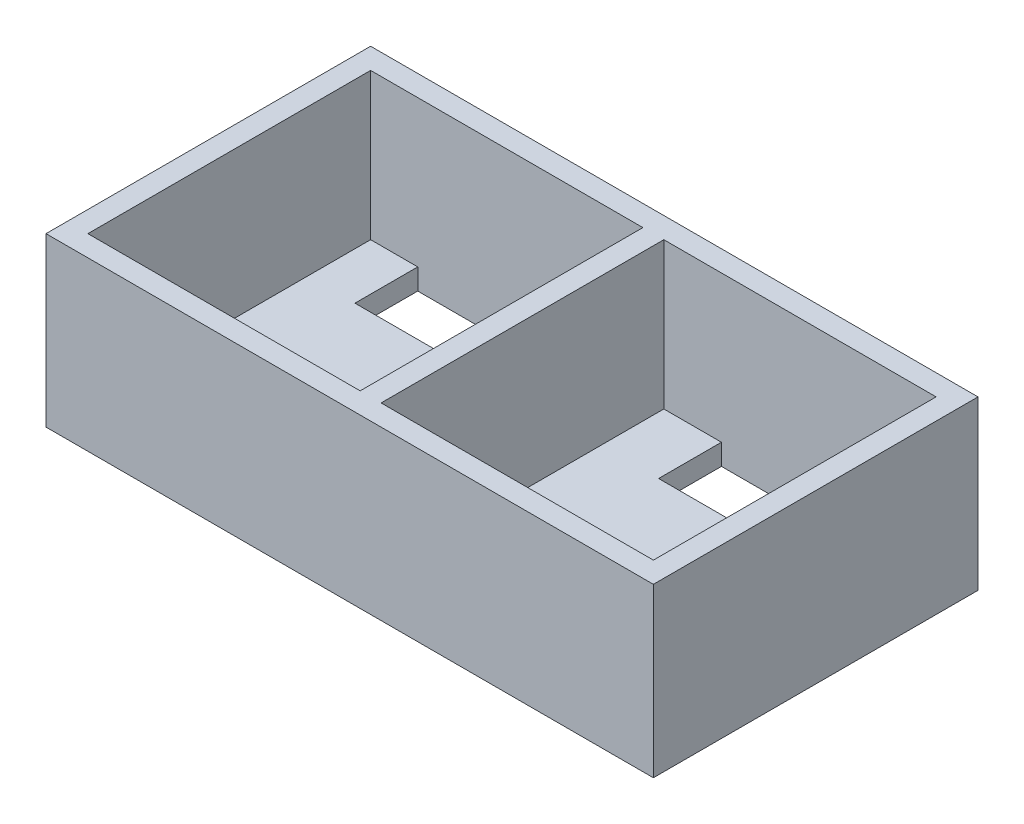
ISO-10303-21;
HEADER;
FILE_DESCRIPTION(('STEP AP214'),'2;1');
FILE_NAME('part.step','',(''),(''),'','','');
FILE_SCHEMA(('AUTOMOTIVE_DESIGN { 1 0 10303 214 1 1 1 1 }'));
ENDSEC;
DATA;
#1=APPLICATION_CONTEXT('core data for automotive mechanical design processes');
#2=APPLICATION_PROTOCOL_DEFINITION('international standard','automotive_design',2000,#1);
#3=PRODUCT_CONTEXT('',#1,'mechanical');
#4=PRODUCT('Part','Part','',(#3));
#5=PRODUCT_RELATED_PRODUCT_CATEGORY('part','',(#4));
#6=PRODUCT_DEFINITION_FORMATION('','',#4);
#7=PRODUCT_DEFINITION_CONTEXT('part definition',#1,'design');
#8=PRODUCT_DEFINITION('design','',#6,#7);
#9=PRODUCT_DEFINITION_SHAPE('','',#8);
#10=(LENGTH_UNIT() NAMED_UNIT(*) SI_UNIT(.MILLI.,.METRE.));
#11=(NAMED_UNIT(*) PLANE_ANGLE_UNIT() SI_UNIT($,.RADIAN.));
#12=(NAMED_UNIT(*) SI_UNIT($,.STERADIAN.) SOLID_ANGLE_UNIT());
#13=UNCERTAINTY_MEASURE_WITH_UNIT(LENGTH_MEASURE(1.E-05),#10,'distance_accuracy_value','');
#14=(GEOMETRIC_REPRESENTATION_CONTEXT(3) GLOBAL_UNCERTAINTY_ASSIGNED_CONTEXT((#13)) GLOBAL_UNIT_ASSIGNED_CONTEXT((#10,
#11,#12)) REPRESENTATION_CONTEXT('',''));
#15=CARTESIAN_POINT('',(0.,0.,0.));
#16=DIRECTION('',(0.,0.,1.));
#17=DIRECTION('',(1.,0.,0.));
#18=AXIS2_PLACEMENT_3D('',#15,#16,#17);
#19=CARTESIAN_POINT('',(0.,1.,0.));
#20=DIRECTION('',(0.,-1.,0.));
#21=DIRECTION('',(0.,0.,-1.));
#22=AXIS2_PLACEMENT_3D('',#19,#20,#21);
#23=PLANE('',#22);
#24=DIRECTION('',(0.,0.,-1.));
#25=VECTOR('',#24,1.);
#26=CARTESIAN_POINT('',(11.25,1.,0.));
#27=LINE('',#26,#25);
#28=CARTESIAN_POINT('',(11.25,1.,6.75000000000001));
#29=VERTEX_POINT('',#28);
#30=CARTESIAN_POINT('',(11.25,1.,3.75000000000001));
#31=VERTEX_POINT('',#30);
#32=EDGE_CURVE('E399',#29,#31,#27,.T.);
#33=ORIENTED_EDGE('',*,*,#32,.F.);
#34=DIRECTION('',(1.,0.,0.));
#35=VECTOR('',#34,1.);
#36=CARTESIAN_POINT('',(0.,1.,6.75));
#37=LINE('',#36,#35);
#38=CARTESIAN_POINT('',(13.5,1.,6.75000000000001));
#39=VERTEX_POINT('',#38);
#40=EDGE_CURVE('E300',#29,#39,#37,.T.);
#41=ORIENTED_EDGE('',*,*,#40,.T.);
#42=DIRECTION('',(0.,0.,-1.));
#43=VECTOR('',#42,1.);
#44=CARTESIAN_POINT('',(13.5,1.,0.));
#45=LINE('',#44,#43);
#46=CARTESIAN_POINT('',(13.5,1.,-6.75000000000001));
#47=VERTEX_POINT('',#46);
#48=EDGE_CURVE('E254',#39,#47,#45,.T.);
#49=ORIENTED_EDGE('',*,*,#48,.T.);
#50=DIRECTION('',(-1.,0.,0.));
#51=VECTOR('',#50,1.);
#52=CARTESIAN_POINT('',(0.,1.,-6.75));
#53=LINE('',#52,#51);
#54=CARTESIAN_POINT('',(11.25,1.,-6.75));
#55=VERTEX_POINT('',#54);
#56=EDGE_CURVE('E231',#47,#55,#53,.T.);
#57=ORIENTED_EDGE('',*,*,#56,.T.);
#58=DIRECTION('',(0.,0.,1.));
#59=VECTOR('',#58,1.);
#60=CARTESIAN_POINT('',(11.25,1.,0.));
#61=LINE('',#60,#59);
#62=CARTESIAN_POINT('',(11.25,1.,-3.75));
#63=VERTEX_POINT('',#62);
#64=EDGE_CURVE('E241',#55,#63,#61,.T.);
#65=ORIENTED_EDGE('',*,*,#64,.T.);
#66=DIRECTION('',(-1.,0.,0.));
#67=VECTOR('',#66,1.);
#68=CARTESIAN_POINT('',(0.,1.,-3.75));
#69=LINE('',#68,#67);
#70=CARTESIAN_POINT('',(3.25,1.,-3.75));
#71=VERTEX_POINT('',#70);
#72=EDGE_CURVE('E238',#63,#71,#69,.T.);
#73=ORIENTED_EDGE('',*,*,#72,.T.);
#74=DIRECTION('',(0.,0.,1.));
#75=VECTOR('',#74,1.);
#76=CARTESIAN_POINT('',(3.25,1.,0.));
#77=LINE('',#76,#75);
#78=CARTESIAN_POINT('',(3.25,1.,-6.75));
#79=VERTEX_POINT('',#78);
#80=EDGE_CURVE('E249',#79,#71,#77,.T.);
#81=ORIENTED_EDGE('',*,*,#80,.F.);
#82=CARTESIAN_POINT('',(0.5,1.,-6.75000000000001));
#83=VERTEX_POINT('',#82);
#84=EDGE_CURVE('E258',#79,#83,#53,.T.);
#85=ORIENTED_EDGE('',*,*,#84,.T.);
#86=DIRECTION('',(0.,0.,-1.));
#87=VECTOR('',#86,1.);
#88=CARTESIAN_POINT('',(0.5,1.,-6.75000000000001));
#89=LINE('',#88,#87);
#90=CARTESIAN_POINT('',(0.5,1.,6.75));
#91=VERTEX_POINT('',#90);
#92=EDGE_CURVE('E356',#91,#83,#89,.T.);
#93=ORIENTED_EDGE('',*,*,#92,.F.);
#94=CARTESIAN_POINT('',(3.25,1.,6.75000000000001));
#95=VERTEX_POINT('',#94);
#96=EDGE_CURVE('E323',#91,#95,#37,.T.);
#97=ORIENTED_EDGE('',*,*,#96,.T.);
#98=DIRECTION('',(0.,0.,-1.));
#99=VECTOR('',#98,1.);
#100=CARTESIAN_POINT('',(3.25,1.,0.));
#101=LINE('',#100,#99);
#102=CARTESIAN_POINT('',(3.25,1.,3.75000000000001));
#103=VERTEX_POINT('',#102);
#104=EDGE_CURVE('E413',#95,#103,#101,.T.);
#105=ORIENTED_EDGE('',*,*,#104,.T.);
#106=DIRECTION('',(-1.,0.,0.));
#107=VECTOR('',#106,1.);
#108=CARTESIAN_POINT('',(0.,1.,3.75));
#109=LINE('',#108,#107);
#110=EDGE_CURVE('E425',#31,#103,#109,.T.);
#111=ORIENTED_EDGE('',*,*,#110,.F.);
#112=EDGE_LOOP('',(#33,#41,#49,#57,#65,#73,#81,#85,#93,#97,#105,#111));
#113=FACE_BOUND('',#112,.T.);
#114=ADVANCED_FACE('F39',(#113),#23,.F.);
#115=CARTESIAN_POINT('',(0.,0.,0.));
#116=DIRECTION('',(0.,-1.,0.));
#117=DIRECTION('',(0.,0.,-1.));
#118=AXIS2_PLACEMENT_3D('',#115,#116,#117);
#119=PLANE('',#118);
#120=DIRECTION('',(0.,0.,1.));
#121=VECTOR('',#120,1.);
#122=CARTESIAN_POINT('',(11.25,0.,0.));
#123=LINE('',#122,#121);
#124=CARTESIAN_POINT('',(11.25,0.,3.75000000000001));
#125=VERTEX_POINT('',#124);
#126=CARTESIAN_POINT('',(11.25,0.,6.75000000000001));
#127=VERTEX_POINT('',#126);
#128=EDGE_CURVE('E473',#125,#127,#123,.T.);
#129=ORIENTED_EDGE('',*,*,#128,.F.);
#130=DIRECTION('',(1.,0.,0.));
#131=VECTOR('',#130,1.);
#132=CARTESIAN_POINT('',(0.,0.,3.75));
#133=LINE('',#132,#131);
#134=CARTESIAN_POINT('',(3.25,0.,3.75000000000001));
#135=VERTEX_POINT('',#134);
#136=EDGE_CURVE('E459',#135,#125,#133,.T.);
#137=ORIENTED_EDGE('',*,*,#136,.F.);
#138=DIRECTION('',(0.,0.,1.));
#139=VECTOR('',#138,1.);
#140=CARTESIAN_POINT('',(3.25,0.,0.));
#141=LINE('',#140,#139);
#142=CARTESIAN_POINT('',(3.25,0.,6.75000000000001));
#143=VERTEX_POINT('',#142);
#144=EDGE_CURVE('E466',#135,#143,#141,.T.);
#145=ORIENTED_EDGE('',*,*,#144,.T.);
#146=DIRECTION('',(-1.,0.,0.));
#147=VECTOR('',#146,1.);
#148=CARTESIAN_POINT('',(0.,0.,6.75));
#149=LINE('',#148,#147);
#150=EDGE_CURVE('E470',#127,#143,#149,.T.);
#151=ORIENTED_EDGE('',*,*,#150,.F.);
#152=EDGE_LOOP('',(#129,#137,#145,#151));
#153=FACE_BOUND('',#152,.T.);
#154=DIRECTION('',(0.,0.,1.));
#155=VECTOR('',#154,1.);
#156=CARTESIAN_POINT('',(-14.5,0.,7.75));
#157=LINE('',#156,#155);
#158=CARTESIAN_POINT('',(-14.5,0.,-7.75));
#159=VERTEX_POINT('',#158);
#160=CARTESIAN_POINT('',(-14.5,0.,7.75));
#161=VERTEX_POINT('',#160);
#162=EDGE_CURVE('E311',#159,#161,#157,.T.);
#163=ORIENTED_EDGE('',*,*,#162,.F.);
#164=DIRECTION('',(-1.,0.,0.));
#165=VECTOR('',#164,1.);
#166=CARTESIAN_POINT('',(-14.5,0.,-7.75));
#167=LINE('',#166,#165);
#168=CARTESIAN_POINT('',(14.5,0.,-7.75000000000001));
#169=VERTEX_POINT('',#168);
#170=EDGE_CURVE('E520',#169,#159,#167,.T.);
#171=ORIENTED_EDGE('',*,*,#170,.F.);
#172=DIRECTION('',(0.,0.,-1.));
#173=VECTOR('',#172,1.);
#174=CARTESIAN_POINT('',(14.5,0.,7.75000000000001));
#175=LINE('',#174,#173);
#176=CARTESIAN_POINT('',(14.5,0.,7.75000000000001));
#177=VERTEX_POINT('',#176);
#178=EDGE_CURVE('E536',#177,#169,#175,.T.);
#179=ORIENTED_EDGE('',*,*,#178,.F.);
#180=DIRECTION('',(1.,0.,0.));
#181=VECTOR('',#180,1.);
#182=CARTESIAN_POINT('',(-14.5,0.,7.75));
#183=LINE('',#182,#181);
#184=EDGE_CURVE('E533',#161,#177,#183,.T.);
#185=ORIENTED_EDGE('',*,*,#184,.F.);
#186=EDGE_LOOP('',(#163,#171,#179,#185));
#187=FACE_BOUND('',#186,.T.);
#188=DIRECTION('',(-1.,0.,0.));
#189=VECTOR('',#188,1.);
#190=CARTESIAN_POINT('',(0.,0.,-3.75));
#191=LINE('',#190,#189);
#192=CARTESIAN_POINT('',(-3.25,0.,-3.75));
#193=VERTEX_POINT('',#192);
#194=CARTESIAN_POINT('',(-11.25,0.,-3.75));
#195=VERTEX_POINT('',#194);
#196=EDGE_CURVE('E563',#193,#195,#191,.T.);
#197=ORIENTED_EDGE('',*,*,#196,.F.);
#198=DIRECTION('',(0.,0.,-1.));
#199=VECTOR('',#198,1.);
#200=CARTESIAN_POINT('',(-3.25,0.,0.));
#201=LINE('',#200,#199);
#202=CARTESIAN_POINT('',(-3.25,0.,-6.75));
#203=VERTEX_POINT('',#202);
#204=EDGE_CURVE('E566',#193,#203,#201,.T.);
#205=ORIENTED_EDGE('',*,*,#204,.T.);
#206=DIRECTION('',(1.,0.,0.));
#207=VECTOR('',#206,1.);
#208=CARTESIAN_POINT('',(0.,0.,-6.75));
#209=LINE('',#208,#207);
#210=CARTESIAN_POINT('',(-11.25,0.,-6.75));
#211=VERTEX_POINT('',#210);
#212=EDGE_CURVE('E556',#211,#203,#209,.T.);
#213=ORIENTED_EDGE('',*,*,#212,.F.);
#214=DIRECTION('',(0.,0.,-1.));
#215=VECTOR('',#214,1.);
#216=CARTESIAN_POINT('',(-11.25,0.,0.));
#217=LINE('',#216,#215);
#218=EDGE_CURVE('E559',#195,#211,#217,.T.);
#219=ORIENTED_EDGE('',*,*,#218,.F.);
#220=EDGE_LOOP('',(#197,#205,#213,#219));
#221=FACE_BOUND('',#220,.T.);
#222=DIRECTION('',(1.,0.,0.));
#223=VECTOR('',#222,1.);
#224=CARTESIAN_POINT('',(0.,0.,-3.75));
#225=LINE('',#224,#223);
#226=CARTESIAN_POINT('',(3.25,0.,-3.75));
#227=VERTEX_POINT('',#226);
#228=CARTESIAN_POINT('',(11.25,0.,-3.75));
#229=VERTEX_POINT('',#228);
#230=EDGE_CURVE('E451',#227,#229,#225,.T.);
#231=ORIENTED_EDGE('',*,*,#230,.T.);
#232=DIRECTION('',(0.,0.,-1.));
#233=VECTOR('',#232,1.);
#234=CARTESIAN_POINT('',(11.25,0.,0.));
#235=LINE('',#234,#233);
#236=CARTESIAN_POINT('',(11.25,0.,-6.75));
#237=VERTEX_POINT('',#236);
#238=EDGE_CURVE('E454',#229,#237,#235,.T.);
#239=ORIENTED_EDGE('',*,*,#238,.T.);
#240=DIRECTION('',(1.,0.,0.));
#241=VECTOR('',#240,1.);
#242=CARTESIAN_POINT('',(0.,0.,-6.75));
#243=LINE('',#242,#241);
#244=CARTESIAN_POINT('',(3.25,0.,-6.75));
#245=VERTEX_POINT('',#244);
#246=EDGE_CURVE('E233',#245,#237,#243,.T.);
#247=ORIENTED_EDGE('',*,*,#246,.F.);
#248=DIRECTION('',(0.,0.,-1.));
#249=VECTOR('',#248,1.);
#250=CARTESIAN_POINT('',(3.25,0.,0.));
#251=LINE('',#250,#249);
#252=EDGE_CURVE('E455',#227,#245,#251,.T.);
#253=ORIENTED_EDGE('',*,*,#252,.F.);
#254=EDGE_LOOP('',(#231,#239,#247,#253));
#255=FACE_BOUND('',#254,.T.);
#256=DIRECTION('',(-1.,0.,0.));
#257=VECTOR('',#256,1.);
#258=CARTESIAN_POINT('',(0.,0.,3.75));
#259=LINE('',#258,#257);
#260=CARTESIAN_POINT('',(-3.25,0.,3.75));
#261=VERTEX_POINT('',#260);
#262=CARTESIAN_POINT('',(-11.25,0.,3.75));
#263=VERTEX_POINT('',#262);
#264=EDGE_CURVE('E48',#261,#263,#259,.T.);
#265=ORIENTED_EDGE('',*,*,#264,.T.);
#266=DIRECTION('',(0.,0.,1.));
#267=VECTOR('',#266,1.);
#268=CARTESIAN_POINT('',(-11.25,0.,0.));
#269=LINE('',#268,#267);
#270=CARTESIAN_POINT('',(-11.25,0.,6.75));
#271=VERTEX_POINT('',#270);
#272=EDGE_CURVE('E11',#263,#271,#269,.T.);
#273=ORIENTED_EDGE('',*,*,#272,.T.);
#274=DIRECTION('',(-1.,0.,0.));
#275=VECTOR('',#274,1.);
#276=CARTESIAN_POINT('',(0.,0.,6.75));
#277=LINE('',#276,#275);
#278=CARTESIAN_POINT('',(-3.25,0.,6.75));
#279=VERTEX_POINT('',#278);
#280=EDGE_CURVE('E476',#279,#271,#277,.T.);
#281=ORIENTED_EDGE('',*,*,#280,.F.);
#282=DIRECTION('',(0.,0.,1.));
#283=VECTOR('',#282,1.);
#284=CARTESIAN_POINT('',(-3.25,0.,0.));
#285=LINE('',#284,#283);
#286=EDGE_CURVE('E479',#261,#279,#285,.T.);
#287=ORIENTED_EDGE('',*,*,#286,.F.);
#288=EDGE_LOOP('',(#265,#273,#281,#287));
#289=FACE_BOUND('',#288,.T.);
#290=ADVANCED_FACE('F486',(#153,#187,#221,#255,#289),#119,.T.);
#291=CARTESIAN_POINT('',(-14.5,8.,6.75));
#292=DIRECTION('',(0.,0.,-1.));
#293=DIRECTION('',(-1.,0.,0.));
#294=AXIS2_PLACEMENT_3D('',#291,#292,#293);
#295=PLANE('',#294);
#296=DIRECTION('',(1.,0.,0.));
#297=VECTOR('',#296,1.);
#298=CARTESIAN_POINT('',(0.,8.,6.75));
#299=LINE('',#298,#297);
#300=CARTESIAN_POINT('',(-13.5,8.,6.75));
#301=VERTEX_POINT('',#300);
#302=CARTESIAN_POINT('',(-0.5,8.,6.75));
#303=VERTEX_POINT('',#302);
#304=EDGE_CURVE('E508',#301,#303,#299,.T.);
#305=ORIENTED_EDGE('',*,*,#304,.T.);
#306=DIRECTION('',(0.,-1.,0.));
#307=VECTOR('',#306,1.);
#308=CARTESIAN_POINT('',(-0.499999999999999,8.,6.75));
#309=LINE('',#308,#307);
#310=CARTESIAN_POINT('',(-0.499999999999999,1.,6.75));
#311=VERTEX_POINT('',#310);
#312=EDGE_CURVE('E295',#303,#311,#309,.T.);
#313=ORIENTED_EDGE('',*,*,#312,.T.);
#314=CARTESIAN_POINT('',(-3.25,1.,6.75));
#315=VERTEX_POINT('',#314);
#316=EDGE_CURVE('E322',#315,#311,#37,.T.);
#317=ORIENTED_EDGE('',*,*,#316,.F.);
#318=DIRECTION('',(0.,1.,0.));
#319=VECTOR('',#318,1.);
#320=CARTESIAN_POINT('',(-3.25,-6.,6.75));
#321=LINE('',#320,#319);
#322=EDGE_CURVE('E389',#279,#315,#321,.T.);
#323=ORIENTED_EDGE('',*,*,#322,.F.);
#324=ORIENTED_EDGE('',*,*,#280,.T.);
#325=DIRECTION('',(0.,1.,0.));
#326=VECTOR('',#325,1.);
#327=CARTESIAN_POINT('',(-11.25,-6.,6.75));
#328=LINE('',#327,#326);
#329=CARTESIAN_POINT('',(-11.25,1.,6.75));
#330=VERTEX_POINT('',#329);
#331=EDGE_CURVE('E386',#271,#330,#328,.T.);
#332=ORIENTED_EDGE('',*,*,#331,.T.);
#333=CARTESIAN_POINT('',(-13.5,1.,6.75));
#334=VERTEX_POINT('',#333);
#335=EDGE_CURVE('E319',#334,#330,#37,.T.);
#336=ORIENTED_EDGE('',*,*,#335,.F.);
#337=DIRECTION('',(0.,-1.,0.));
#338=VECTOR('',#337,1.);
#339=CARTESIAN_POINT('',(-13.5,8.,6.75));
#340=LINE('',#339,#338);
#341=EDGE_CURVE('E307',#301,#334,#340,.T.);
#342=ORIENTED_EDGE('',*,*,#341,.F.);
#343=EDGE_LOOP('',(#305,#313,#317,#323,#324,#332,#336,#342));
#344=FACE_BOUND('',#343,.T.);
#345=ADVANCED_FACE('F495',(#344),#295,.T.);
#346=ORIENTED_EDGE('',*,*,#96,.F.);
#347=DIRECTION('',(0.,-1.,0.));
#348=VECTOR('',#347,1.);
#349=CARTESIAN_POINT('',(0.500000000000001,8.,6.75));
#350=LINE('',#349,#348);
#351=CARTESIAN_POINT('',(0.500000000000002,8.,6.75));
#352=VERTEX_POINT('',#351);
#353=EDGE_CURVE('E303',#352,#91,#350,.T.);
#354=ORIENTED_EDGE('',*,*,#353,.F.);
#355=CARTESIAN_POINT('',(13.5,8.,6.75000000000001));
#356=VERTEX_POINT('',#355);
#357=EDGE_CURVE('E264',#352,#356,#299,.T.);
#358=ORIENTED_EDGE('',*,*,#357,.T.);
#359=DIRECTION('',(0.,-1.,0.));
#360=VECTOR('',#359,1.);
#361=CARTESIAN_POINT('',(13.5,8.,6.75000000000001));
#362=LINE('',#361,#360);
#363=EDGE_CURVE('E312',#356,#39,#362,.T.);
#364=ORIENTED_EDGE('',*,*,#363,.T.);
#365=ORIENTED_EDGE('',*,*,#40,.F.);
#366=DIRECTION('',(0.,1.,0.));
#367=VECTOR('',#366,1.);
#368=CARTESIAN_POINT('',(11.25,-6.,6.75000000000001));
#369=LINE('',#368,#367);
#370=EDGE_CURVE('E250',#127,#29,#369,.T.);
#371=ORIENTED_EDGE('',*,*,#370,.F.);
#372=ORIENTED_EDGE('',*,*,#150,.T.);
#373=DIRECTION('',(0.,1.,0.));
#374=VECTOR('',#373,1.);
#375=CARTESIAN_POINT('',(3.25,-6.,6.75000000000001));
#376=LINE('',#375,#374);
#377=EDGE_CURVE('E417',#143,#95,#376,.T.);
#378=ORIENTED_EDGE('',*,*,#377,.T.);
#379=EDGE_LOOP('',(#346,#354,#358,#364,#365,#371,#372,#378));
#380=FACE_BOUND('',#379,.T.);
#381=ADVANCED_FACE('F608',(#380),#295,.T.);
#382=CARTESIAN_POINT('',(-14.5,8.,-6.75));
#383=DIRECTION('',(0.,0.,1.));
#384=DIRECTION('',(1.,0.,0.));
#385=AXIS2_PLACEMENT_3D('',#382,#383,#384);
#386=PLANE('',#385);
#387=CARTESIAN_POINT('',(-0.5,1.,-6.75));
#388=VERTEX_POINT('',#387);
#389=CARTESIAN_POINT('',(-3.25,1.,-6.75));
#390=VERTEX_POINT('',#389);
#391=EDGE_CURVE('E261',#388,#390,#53,.T.);
#392=ORIENTED_EDGE('',*,*,#391,.F.);
#393=DIRECTION('',(0.,-1.,0.));
#394=VECTOR('',#393,1.);
#395=CARTESIAN_POINT('',(-0.500000000000001,8.,-6.75));
#396=LINE('',#395,#394);
#397=CARTESIAN_POINT('',(-0.5,8.,-6.75));
#398=VERTEX_POINT('',#397);
#399=EDGE_CURVE('E283',#398,#388,#396,.T.);
#400=ORIENTED_EDGE('',*,*,#399,.F.);
#401=DIRECTION('',(-1.,0.,0.));
#402=VECTOR('',#401,1.);
#403=CARTESIAN_POINT('',(0.,8.,-6.75));
#404=LINE('',#403,#402);
#405=CARTESIAN_POINT('',(-13.5,8.,-6.75));
#406=VERTEX_POINT('',#405);
#407=EDGE_CURVE('E344',#398,#406,#404,.T.);
#408=ORIENTED_EDGE('',*,*,#407,.T.);
#409=DIRECTION('',(0.,-1.,0.));
#410=VECTOR('',#409,1.);
#411=CARTESIAN_POINT('',(-13.5,8.,-6.75));
#412=LINE('',#411,#410);
#413=CARTESIAN_POINT('',(-13.5,1.,-6.75));
#414=VERTEX_POINT('',#413);
#415=EDGE_CURVE('E313',#406,#414,#412,.T.);
#416=ORIENTED_EDGE('',*,*,#415,.T.);
#417=CARTESIAN_POINT('',(-11.25,1.,-6.75));
#418=VERTEX_POINT('',#417);
#419=EDGE_CURVE('E260',#418,#414,#53,.T.);
#420=ORIENTED_EDGE('',*,*,#419,.F.);
#421=DIRECTION('',(0.,1.,0.));
#422=VECTOR('',#421,1.);
#423=CARTESIAN_POINT('',(-11.25,-6.,-6.75));
#424=LINE('',#423,#422);
#425=EDGE_CURVE('E370',#211,#418,#424,.T.);
#426=ORIENTED_EDGE('',*,*,#425,.F.);
#427=ORIENTED_EDGE('',*,*,#212,.T.);
#428=DIRECTION('',(0.,1.,0.));
#429=VECTOR('',#428,1.);
#430=CARTESIAN_POINT('',(-3.25,-6.,-6.75));
#431=LINE('',#430,#429);
#432=EDGE_CURVE('E286',#203,#390,#431,.T.);
#433=ORIENTED_EDGE('',*,*,#432,.T.);
#434=EDGE_LOOP('',(#392,#400,#408,#416,#420,#426,#427,#433));
#435=FACE_BOUND('',#434,.T.);
#436=ADVANCED_FACE('F282',(#435),#386,.T.);
#437=CARTESIAN_POINT('',(13.5,8.,-6.75000000000001));
#438=VERTEX_POINT('',#437);
#439=CARTESIAN_POINT('',(0.500000000000002,8.,-6.75));
#440=VERTEX_POINT('',#439);
#441=EDGE_CURVE('E318',#438,#440,#404,.T.);
#442=ORIENTED_EDGE('',*,*,#441,.T.);
#443=DIRECTION('',(0.,-1.,0.));
#444=VECTOR('',#443,1.);
#445=CARTESIAN_POINT('',(0.5,8.,-6.75000000000001));
#446=LINE('',#445,#444);
#447=EDGE_CURVE('E340',#440,#83,#446,.T.);
#448=ORIENTED_EDGE('',*,*,#447,.T.);
#449=ORIENTED_EDGE('',*,*,#84,.F.);
#450=DIRECTION('',(0.,1.,0.));
#451=VECTOR('',#450,1.);
#452=CARTESIAN_POINT('',(3.25,-6.,-6.75));
#453=LINE('',#452,#451);
#454=EDGE_CURVE('E237',#245,#79,#453,.T.);
#455=ORIENTED_EDGE('',*,*,#454,.F.);
#456=ORIENTED_EDGE('',*,*,#246,.T.);
#457=DIRECTION('',(0.,1.,0.));
#458=VECTOR('',#457,1.);
#459=CARTESIAN_POINT('',(11.25,-6.,-6.75));
#460=LINE('',#459,#458);
#461=EDGE_CURVE('E227',#237,#55,#460,.T.);
#462=ORIENTED_EDGE('',*,*,#461,.T.);
#463=ORIENTED_EDGE('',*,*,#56,.F.);
#464=DIRECTION('',(0.,-1.,0.));
#465=VECTOR('',#464,1.);
#466=CARTESIAN_POINT('',(13.5,8.,-6.75000000000001));
#467=LINE('',#466,#465);
#468=EDGE_CURVE('E317',#438,#47,#467,.T.);
#469=ORIENTED_EDGE('',*,*,#468,.F.);
#470=EDGE_LOOP('',(#442,#448,#449,#455,#456,#462,#463,#469));
#471=FACE_BOUND('',#470,.T.);
#472=ADVANCED_FACE('F229',(#471),#386,.T.);
#473=ORIENTED_EDGE('',*,*,#335,.T.);
#474=DIRECTION('',(0.,0.,-1.));
#475=VECTOR('',#474,1.);
#476=CARTESIAN_POINT('',(-11.25,1.,0.));
#477=LINE('',#476,#475);
#478=CARTESIAN_POINT('',(-11.25,1.,3.75));
#479=VERTEX_POINT('',#478);
#480=EDGE_CURVE('E405',#330,#479,#477,.T.);
#481=ORIENTED_EDGE('',*,*,#480,.T.);
#482=DIRECTION('',(1.,0.,0.));
#483=VECTOR('',#482,1.);
#484=CARTESIAN_POINT('',(0.,1.,3.75));
#485=LINE('',#484,#483);
#486=CARTESIAN_POINT('',(-3.25,1.,3.75));
#487=VERTEX_POINT('',#486);
#488=EDGE_CURVE('E390',#479,#487,#485,.T.);
#489=ORIENTED_EDGE('',*,*,#488,.T.);
#490=DIRECTION('',(0.,0.,-1.));
#491=VECTOR('',#490,1.);
#492=CARTESIAN_POINT('',(-3.25,1.,0.));
#493=LINE('',#492,#491);
#494=EDGE_CURVE('E55',#315,#487,#493,.T.);
#495=ORIENTED_EDGE('',*,*,#494,.F.);
#496=ORIENTED_EDGE('',*,*,#316,.T.);
#497=DIRECTION('',(0.,0.,1.));
#498=VECTOR('',#497,1.);
#499=CARTESIAN_POINT('',(-0.500000000000001,1.,-6.75));
#500=LINE('',#499,#498);
#501=EDGE_CURVE('E279',#388,#311,#500,.T.);
#502=ORIENTED_EDGE('',*,*,#501,.F.);
#503=ORIENTED_EDGE('',*,*,#391,.T.);
#504=DIRECTION('',(0.,0.,1.));
#505=VECTOR('',#504,1.);
#506=CARTESIAN_POINT('',(-3.25,1.,0.));
#507=LINE('',#506,#505);
#508=CARTESIAN_POINT('',(-3.25,1.,-3.75));
#509=VERTEX_POINT('',#508);
#510=EDGE_CURVE('E277',#390,#509,#507,.T.);
#511=ORIENTED_EDGE('',*,*,#510,.T.);
#512=DIRECTION('',(1.,0.,0.));
#513=VECTOR('',#512,1.);
#514=CARTESIAN_POINT('',(0.,1.,-3.75));
#515=LINE('',#514,#513);
#516=CARTESIAN_POINT('',(-11.25,1.,-3.75));
#517=VERTEX_POINT('',#516);
#518=EDGE_CURVE('E371',#517,#509,#515,.T.);
#519=ORIENTED_EDGE('',*,*,#518,.F.);
#520=DIRECTION('',(0.,0.,1.));
#521=VECTOR('',#520,1.);
#522=CARTESIAN_POINT('',(-11.25,1.,0.));
#523=LINE('',#522,#521);
#524=EDGE_CURVE('E63',#418,#517,#523,.T.);
#525=ORIENTED_EDGE('',*,*,#524,.F.);
#526=ORIENTED_EDGE('',*,*,#419,.T.);
#527=DIRECTION('',(0.,0.,1.));
#528=VECTOR('',#527,1.);
#529=CARTESIAN_POINT('',(-13.5,1.,0.));
#530=LINE('',#529,#528);
#531=EDGE_CURVE('E294',#414,#334,#530,.T.);
#532=ORIENTED_EDGE('',*,*,#531,.T.);
#533=EDGE_LOOP('',(#473,#481,#489,#495,#496,#502,#503,#511,#519,#525,#526,#532));
#534=FACE_BOUND('',#533,.T.);
#535=ADVANCED_FACE('F274',(#534),#23,.F.);
#536=CARTESIAN_POINT('',(0.,8.,0.));
#537=DIRECTION('',(0.,-1.,0.));
#538=DIRECTION('',(0.,0.,-1.));
#539=AXIS2_PLACEMENT_3D('',#536,#537,#538);
#540=PLANE('',#539);
#541=ORIENTED_EDGE('',*,*,#357,.F.);
#542=DIRECTION('',(0.,0.,-1.));
#543=VECTOR('',#542,1.);
#544=CARTESIAN_POINT('',(0.5,8.,-6.75000000000001));
#545=LINE('',#544,#543);
#546=EDGE_CURVE('E348',#352,#440,#545,.T.);
#547=ORIENTED_EDGE('',*,*,#546,.T.);
#548=ORIENTED_EDGE('',*,*,#441,.F.);
#549=DIRECTION('',(0.,0.,-1.));
#550=VECTOR('',#549,1.);
#551=CARTESIAN_POINT('',(13.5,8.,0.));
#552=LINE('',#551,#550);
#553=EDGE_CURVE('E334',#356,#438,#552,.T.);
#554=ORIENTED_EDGE('',*,*,#553,.F.);
#555=EDGE_LOOP('',(#541,#547,#548,#554));
#556=FACE_BOUND('',#555,.T.);
#557=DIRECTION('',(0.,0.,1.));
#558=VECTOR('',#557,1.);
#559=CARTESIAN_POINT('',(-14.5,8.,7.75));
#560=LINE('',#559,#558);
#561=CARTESIAN_POINT('',(-14.5,8.,-7.75));
#562=VERTEX_POINT('',#561);
#563=CARTESIAN_POINT('',(-14.5,8.,7.75));
#564=VERTEX_POINT('',#563);
#565=EDGE_CURVE('E515',#562,#564,#560,.T.);
#566=ORIENTED_EDGE('',*,*,#565,.T.);
#567=DIRECTION('',(1.,0.,0.));
#568=VECTOR('',#567,1.);
#569=CARTESIAN_POINT('',(-14.5,8.,7.75));
#570=LINE('',#569,#568);
#571=CARTESIAN_POINT('',(14.5,8.,7.75000000000001));
#572=VERTEX_POINT('',#571);
#573=EDGE_CURVE('E519',#564,#572,#570,.T.);
#574=ORIENTED_EDGE('',*,*,#573,.T.);
#575=DIRECTION('',(0.,0.,-1.));
#576=VECTOR('',#575,1.);
#577=CARTESIAN_POINT('',(14.5,8.,7.75000000000001));
#578=LINE('',#577,#576);
#579=CARTESIAN_POINT('',(14.5,8.,-7.75000000000001));
#580=VERTEX_POINT('',#579);
#581=EDGE_CURVE('E523',#572,#580,#578,.T.);
#582=ORIENTED_EDGE('',*,*,#581,.T.);
#583=DIRECTION('',(-1.,0.,0.));
#584=VECTOR('',#583,1.);
#585=CARTESIAN_POINT('',(-14.5,8.,-7.75));
#586=LINE('',#585,#584);
#587=EDGE_CURVE('E526',#580,#562,#586,.T.);
#588=ORIENTED_EDGE('',*,*,#587,.T.);
#589=EDGE_LOOP('',(#566,#574,#582,#588));
#590=FACE_BOUND('',#589,.T.);
#591=DIRECTION('',(0.,0.,1.));
#592=VECTOR('',#591,1.);
#593=CARTESIAN_POINT('',(-13.5,8.,0.));
#594=LINE('',#593,#592);
#595=EDGE_CURVE('E257',#406,#301,#594,.T.);
#596=ORIENTED_EDGE('',*,*,#595,.F.);
#597=ORIENTED_EDGE('',*,*,#407,.F.);
#598=DIRECTION('',(0.,0.,1.));
#599=VECTOR('',#598,1.);
#600=CARTESIAN_POINT('',(-0.500000000000001,8.,-6.75));
#601=LINE('',#600,#599);
#602=EDGE_CURVE('E292',#398,#303,#601,.T.);
#603=ORIENTED_EDGE('',*,*,#602,.T.);
#604=ORIENTED_EDGE('',*,*,#304,.F.);
#605=EDGE_LOOP('',(#596,#597,#603,#604));
#606=FACE_BOUND('',#605,.T.);
#607=ADVANCED_FACE('F349',(#556,#590,#606),#540,.F.);
#608=CARTESIAN_POINT('',(-14.5,8.,7.75));
#609=DIRECTION('',(1.,0.,0.));
#610=DIRECTION('',(0.,0.,-1.));
#611=AXIS2_PLACEMENT_3D('',#608,#609,#610);
#612=PLANE('',#611);
#613=ORIENTED_EDGE('',*,*,#162,.T.);
#614=DIRECTION('',(0.,-1.,0.));
#615=VECTOR('',#614,1.);
#616=CARTESIAN_POINT('',(-14.5,8.,7.75));
#617=LINE('',#616,#615);
#618=EDGE_CURVE('E552',#564,#161,#617,.T.);
#619=ORIENTED_EDGE('',*,*,#618,.F.);
#620=ORIENTED_EDGE('',*,*,#565,.F.);
#621=DIRECTION('',(0.,-1.,0.));
#622=VECTOR('',#621,1.);
#623=CARTESIAN_POINT('',(-14.5,8.,-7.75));
#624=LINE('',#623,#622);
#625=EDGE_CURVE('E529',#562,#159,#624,.T.);
#626=ORIENTED_EDGE('',*,*,#625,.T.);
#627=EDGE_LOOP('',(#613,#619,#620,#626));
#628=FACE_BOUND('',#627,.T.);
#629=ADVANCED_FACE('F41',(#628),#612,.F.);
#630=CARTESIAN_POINT('',(-14.5,8.,7.75));
#631=DIRECTION('',(0.,0.,-1.));
#632=DIRECTION('',(-1.,0.,0.));
#633=AXIS2_PLACEMENT_3D('',#630,#631,#632);
#634=PLANE('',#633);
#635=ORIENTED_EDGE('',*,*,#184,.T.);
#636=DIRECTION('',(0.,-1.,0.));
#637=VECTOR('',#636,1.);
#638=CARTESIAN_POINT('',(14.5,8.,7.75000000000001));
#639=LINE('',#638,#637);
#640=EDGE_CURVE('E548',#572,#177,#639,.T.);
#641=ORIENTED_EDGE('',*,*,#640,.F.);
#642=ORIENTED_EDGE('',*,*,#573,.F.);
#643=ORIENTED_EDGE('',*,*,#618,.T.);
#644=EDGE_LOOP('',(#635,#641,#642,#643));
#645=FACE_BOUND('',#644,.T.);
#646=ADVANCED_FACE('F863',(#645),#634,.F.);
#647=CARTESIAN_POINT('',(14.5,8.,7.75000000000001));
#648=DIRECTION('',(-1.,0.,0.));
#649=DIRECTION('',(0.,0.,1.));
#650=AXIS2_PLACEMENT_3D('',#647,#648,#649);
#651=PLANE('',#650);
#652=ORIENTED_EDGE('',*,*,#178,.T.);
#653=DIRECTION('',(0.,-1.,0.));
#654=VECTOR('',#653,1.);
#655=CARTESIAN_POINT('',(14.5,8.,-7.75000000000001));
#656=LINE('',#655,#654);
#657=EDGE_CURVE('E544',#580,#169,#656,.T.);
#658=ORIENTED_EDGE('',*,*,#657,.F.);
#659=ORIENTED_EDGE('',*,*,#581,.F.);
#660=ORIENTED_EDGE('',*,*,#640,.T.);
#661=EDGE_LOOP('',(#652,#658,#659,#660));
#662=FACE_BOUND('',#661,.T.);
#663=ADVANCED_FACE('F856',(#662),#651,.F.);
#664=CARTESIAN_POINT('',(-14.5,8.,-7.75));
#665=DIRECTION('',(0.,0.,1.));
#666=DIRECTION('',(1.,0.,0.));
#667=AXIS2_PLACEMENT_3D('',#664,#665,#666);
#668=PLANE('',#667);
#669=ORIENTED_EDGE('',*,*,#170,.T.);
#670=ORIENTED_EDGE('',*,*,#625,.F.);
#671=ORIENTED_EDGE('',*,*,#587,.F.);
#672=ORIENTED_EDGE('',*,*,#657,.T.);
#673=EDGE_LOOP('',(#669,#670,#671,#672));
#674=FACE_BOUND('',#673,.T.);
#675=ADVANCED_FACE('F616',(#674),#668,.F.);
#676=CARTESIAN_POINT('',(-13.5,8.,7.75));
#677=DIRECTION('',(1.,0.,0.));
#678=DIRECTION('',(0.,0.,-1.));
#679=AXIS2_PLACEMENT_3D('',#676,#677,#678);
#680=PLANE('',#679);
#681=ORIENTED_EDGE('',*,*,#531,.F.);
#682=ORIENTED_EDGE('',*,*,#415,.F.);
#683=ORIENTED_EDGE('',*,*,#595,.T.);
#684=ORIENTED_EDGE('',*,*,#341,.T.);
#685=EDGE_LOOP('',(#681,#682,#683,#684));
#686=FACE_BOUND('',#685,.T.);
#687=ADVANCED_FACE('F504',(#686),#680,.T.);
#688=CARTESIAN_POINT('',(13.5,8.,7.75000000000001));
#689=DIRECTION('',(-1.,0.,0.));
#690=DIRECTION('',(0.,0.,1.));
#691=AXIS2_PLACEMENT_3D('',#688,#689,#690);
#692=PLANE('',#691);
#693=ORIENTED_EDGE('',*,*,#48,.F.);
#694=ORIENTED_EDGE('',*,*,#363,.F.);
#695=ORIENTED_EDGE('',*,*,#553,.T.);
#696=ORIENTED_EDGE('',*,*,#468,.T.);
#697=EDGE_LOOP('',(#693,#694,#695,#696));
#698=FACE_BOUND('',#697,.T.);
#699=ADVANCED_FACE('F331',(#698),#692,.T.);
#700=CARTESIAN_POINT('',(-0.500000000000001,8.,-6.75));
#701=DIRECTION('',(1.,0.,0.));
#702=DIRECTION('',(0.,0.,-1.));
#703=AXIS2_PLACEMENT_3D('',#700,#701,#702);
#704=PLANE('',#703);
#705=ORIENTED_EDGE('',*,*,#501,.T.);
#706=ORIENTED_EDGE('',*,*,#312,.F.);
#707=ORIENTED_EDGE('',*,*,#602,.F.);
#708=ORIENTED_EDGE('',*,*,#399,.T.);
#709=EDGE_LOOP('',(#705,#706,#707,#708));
#710=FACE_BOUND('',#709,.T.);
#711=ADVANCED_FACE('F289',(#710),#704,.F.);
#712=CARTESIAN_POINT('',(0.5,8.,-6.75000000000001));
#713=DIRECTION('',(-1.,0.,0.));
#714=DIRECTION('',(0.,0.,1.));
#715=AXIS2_PLACEMENT_3D('',#712,#713,#714);
#716=PLANE('',#715);
#717=ORIENTED_EDGE('',*,*,#92,.T.);
#718=ORIENTED_EDGE('',*,*,#447,.F.);
#719=ORIENTED_EDGE('',*,*,#546,.F.);
#720=ORIENTED_EDGE('',*,*,#353,.T.);
#721=EDGE_LOOP('',(#717,#718,#719,#720));
#722=FACE_BOUND('',#721,.T.);
#723=ADVANCED_FACE('F355',(#722),#716,.F.);
#724=CARTESIAN_POINT('',(-3.25,-6.,0.));
#725=DIRECTION('',(-1.,0.,0.));
#726=DIRECTION('',(0.,0.,1.));
#727=AXIS2_PLACEMENT_3D('',#724,#725,#726);
#728=PLANE('',#727);
#729=DIRECTION('',(0.,1.,0.));
#730=VECTOR('',#729,1.);
#731=CARTESIAN_POINT('',(-3.25,-6.,-3.75));
#732=LINE('',#731,#730);
#733=EDGE_CURVE('E364',#193,#509,#732,.T.);
#734=ORIENTED_EDGE('',*,*,#733,.T.);
#735=ORIENTED_EDGE('',*,*,#510,.F.);
#736=ORIENTED_EDGE('',*,*,#432,.F.);
#737=ORIENTED_EDGE('',*,*,#204,.F.);
#738=EDGE_LOOP('',(#734,#735,#736,#737));
#739=FACE_BOUND('',#738,.T.);
#740=ADVANCED_FACE('F576',(#739),#728,.T.);
#741=CARTESIAN_POINT('',(0.,-6.,-3.75));
#742=DIRECTION('',(0.,0.,1.));
#743=DIRECTION('',(1.,0.,0.));
#744=AXIS2_PLACEMENT_3D('',#741,#742,#743);
#745=PLANE('',#744);
#746=ORIENTED_EDGE('',*,*,#196,.T.);
#747=DIRECTION('',(0.,1.,0.));
#748=VECTOR('',#747,1.);
#749=CARTESIAN_POINT('',(-11.25,-6.,-3.75));
#750=LINE('',#749,#748);
#751=EDGE_CURVE('E374',#195,#517,#750,.T.);
#752=ORIENTED_EDGE('',*,*,#751,.T.);
#753=ORIENTED_EDGE('',*,*,#518,.T.);
#754=ORIENTED_EDGE('',*,*,#733,.F.);
#755=EDGE_LOOP('',(#746,#752,#753,#754));
#756=FACE_BOUND('',#755,.T.);
#757=ADVANCED_FACE('F578',(#756),#745,.F.);
#758=CARTESIAN_POINT('',(-11.25,-6.,0.));
#759=DIRECTION('',(-1.,0.,0.));
#760=DIRECTION('',(0.,0.,1.));
#761=AXIS2_PLACEMENT_3D('',#758,#759,#760);
#762=PLANE('',#761);
#763=ORIENTED_EDGE('',*,*,#218,.T.);
#764=ORIENTED_EDGE('',*,*,#425,.T.);
#765=ORIENTED_EDGE('',*,*,#524,.T.);
#766=ORIENTED_EDGE('',*,*,#751,.F.);
#767=EDGE_LOOP('',(#763,#764,#765,#766));
#768=FACE_BOUND('',#767,.T.);
#769=ADVANCED_FACE('F581',(#768),#762,.F.);
#770=CARTESIAN_POINT('',(11.25,-6.,0.));
#771=DIRECTION('',(-1.,0.,0.));
#772=DIRECTION('',(0.,0.,1.));
#773=AXIS2_PLACEMENT_3D('',#770,#771,#772);
#774=PLANE('',#773);
#775=DIRECTION('',(0.,1.,0.));
#776=VECTOR('',#775,1.);
#777=CARTESIAN_POINT('',(11.25,-6.,-3.75));
#778=LINE('',#777,#776);
#779=EDGE_CURVE('E244',#229,#63,#778,.T.);
#780=ORIENTED_EDGE('',*,*,#779,.T.);
#781=ORIENTED_EDGE('',*,*,#64,.F.);
#782=ORIENTED_EDGE('',*,*,#461,.F.);
#783=ORIENTED_EDGE('',*,*,#238,.F.);
#784=EDGE_LOOP('',(#780,#781,#782,#783));
#785=FACE_BOUND('',#784,.T.);
#786=ADVANCED_FACE('F242',(#785),#774,.T.);
#787=CARTESIAN_POINT('',(0.,-6.,-3.75));
#788=DIRECTION('',(0.,0.,-1.));
#789=DIRECTION('',(-1.,0.,0.));
#790=AXIS2_PLACEMENT_3D('',#787,#788,#789);
#791=PLANE('',#790);
#792=DIRECTION('',(0.,1.,0.));
#793=VECTOR('',#792,1.);
#794=CARTESIAN_POINT('',(3.25,-6.,-3.75));
#795=LINE('',#794,#793);
#796=EDGE_CURVE('E433',#227,#71,#795,.T.);
#797=ORIENTED_EDGE('',*,*,#796,.T.);
#798=ORIENTED_EDGE('',*,*,#72,.F.);
#799=ORIENTED_EDGE('',*,*,#779,.F.);
#800=ORIENTED_EDGE('',*,*,#230,.F.);
#801=EDGE_LOOP('',(#797,#798,#799,#800));
#802=FACE_BOUND('',#801,.T.);
#803=ADVANCED_FACE('F449',(#802),#791,.T.);
#804=CARTESIAN_POINT('',(3.25,-6.,0.));
#805=DIRECTION('',(-1.,0.,0.));
#806=DIRECTION('',(0.,0.,1.));
#807=AXIS2_PLACEMENT_3D('',#804,#805,#806);
#808=PLANE('',#807);
#809=ORIENTED_EDGE('',*,*,#252,.T.);
#810=ORIENTED_EDGE('',*,*,#454,.T.);
#811=ORIENTED_EDGE('',*,*,#80,.T.);
#812=ORIENTED_EDGE('',*,*,#796,.F.);
#813=EDGE_LOOP('',(#809,#810,#811,#812));
#814=FACE_BOUND('',#813,.T.);
#815=ADVANCED_FACE('F446',(#814),#808,.F.);
#816=CARTESIAN_POINT('',(11.25,-6.,0.));
#817=DIRECTION('',(1.,0.,0.));
#818=DIRECTION('',(0.,0.,-1.));
#819=AXIS2_PLACEMENT_3D('',#816,#817,#818);
#820=PLANE('',#819);
#821=ORIENTED_EDGE('',*,*,#128,.T.);
#822=ORIENTED_EDGE('',*,*,#370,.T.);
#823=ORIENTED_EDGE('',*,*,#32,.T.);
#824=DIRECTION('',(0.,1.,0.));
#825=VECTOR('',#824,1.);
#826=CARTESIAN_POINT('',(11.25,-6.,3.75000000000001));
#827=LINE('',#826,#825);
#828=EDGE_CURVE('E409',#125,#31,#827,.T.);
#829=ORIENTED_EDGE('',*,*,#828,.F.);
#830=EDGE_LOOP('',(#821,#822,#823,#829));
#831=FACE_BOUND('',#830,.T.);
#832=ADVANCED_FACE('F661',(#831),#820,.F.);
#833=CARTESIAN_POINT('',(3.25,-6.,0.));
#834=DIRECTION('',(1.,0.,0.));
#835=DIRECTION('',(0.,0.,-1.));
#836=AXIS2_PLACEMENT_3D('',#833,#834,#835);
#837=PLANE('',#836);
#838=DIRECTION('',(0.,1.,0.));
#839=VECTOR('',#838,1.);
#840=CARTESIAN_POINT('',(3.25,-6.,3.75000000000001));
#841=LINE('',#840,#839);
#842=EDGE_CURVE('E412',#135,#103,#841,.T.);
#843=ORIENTED_EDGE('',*,*,#842,.T.);
#844=ORIENTED_EDGE('',*,*,#104,.F.);
#845=ORIENTED_EDGE('',*,*,#377,.F.);
#846=ORIENTED_EDGE('',*,*,#144,.F.);
#847=EDGE_LOOP('',(#843,#844,#845,#846));
#848=FACE_BOUND('',#847,.T.);
#849=ADVANCED_FACE('F672',(#848),#837,.T.);
#850=CARTESIAN_POINT('',(0.,-6.,3.75));
#851=DIRECTION('',(0.,0.,-1.));
#852=DIRECTION('',(-1.,0.,0.));
#853=AXIS2_PLACEMENT_3D('',#850,#851,#852);
#854=PLANE('',#853);
#855=ORIENTED_EDGE('',*,*,#136,.T.);
#856=ORIENTED_EDGE('',*,*,#828,.T.);
#857=ORIENTED_EDGE('',*,*,#110,.T.);
#858=ORIENTED_EDGE('',*,*,#842,.F.);
#859=EDGE_LOOP('',(#855,#856,#857,#858));
#860=FACE_BOUND('',#859,.T.);
#861=ADVANCED_FACE('F684',(#860),#854,.F.);
#862=CARTESIAN_POINT('',(-11.25,-6.,0.));
#863=DIRECTION('',(1.,0.,0.));
#864=DIRECTION('',(0.,0.,-1.));
#865=AXIS2_PLACEMENT_3D('',#862,#863,#864);
#866=PLANE('',#865);
#867=DIRECTION('',(0.,1.,0.));
#868=VECTOR('',#867,1.);
#869=CARTESIAN_POINT('',(-11.25,-6.,3.75));
#870=LINE('',#869,#868);
#871=EDGE_CURVE('E396',#263,#479,#870,.T.);
#872=ORIENTED_EDGE('',*,*,#871,.T.);
#873=ORIENTED_EDGE('',*,*,#480,.F.);
#874=ORIENTED_EDGE('',*,*,#331,.F.);
#875=ORIENTED_EDGE('',*,*,#272,.F.);
#876=EDGE_LOOP('',(#872,#873,#874,#875));
#877=FACE_BOUND('',#876,.T.);
#878=ADVANCED_FACE('F499',(#877),#866,.T.);
#879=CARTESIAN_POINT('',(0.,-6.,3.75));
#880=DIRECTION('',(0.,0.,1.));
#881=DIRECTION('',(1.,0.,0.));
#882=AXIS2_PLACEMENT_3D('',#879,#880,#881);
#883=PLANE('',#882);
#884=DIRECTION('',(0.,1.,0.));
#885=VECTOR('',#884,1.);
#886=CARTESIAN_POINT('',(-3.25,-6.,3.75));
#887=LINE('',#886,#885);
#888=EDGE_CURVE('E393',#261,#487,#887,.T.);
#889=ORIENTED_EDGE('',*,*,#888,.T.);
#890=ORIENTED_EDGE('',*,*,#488,.F.);
#891=ORIENTED_EDGE('',*,*,#871,.F.);
#892=ORIENTED_EDGE('',*,*,#264,.F.);
#893=EDGE_LOOP('',(#889,#890,#891,#892));
#894=FACE_BOUND('',#893,.T.);
#895=ADVANCED_FACE('F490',(#894),#883,.T.);
#896=CARTESIAN_POINT('',(-3.25,-6.,0.));
#897=DIRECTION('',(1.,0.,0.));
#898=DIRECTION('',(0.,0.,-1.));
#899=AXIS2_PLACEMENT_3D('',#896,#897,#898);
#900=PLANE('',#899);
#901=ORIENTED_EDGE('',*,*,#286,.T.);
#902=ORIENTED_EDGE('',*,*,#322,.T.);
#903=ORIENTED_EDGE('',*,*,#494,.T.);
#904=ORIENTED_EDGE('',*,*,#888,.F.);
#905=EDGE_LOOP('',(#901,#902,#903,#904));
#906=FACE_BOUND('',#905,.T.);
#907=ADVANCED_FACE('F492',(#906),#900,.F.);
#908=CLOSED_SHELL('',(#114,#290,#345,#381,#436,#472,#535,#607,#629,#646,#663,#675,#687,#699,
#711,#723,#740,#757,#769,#786,#803,#815,#832,#849,#861,#878,#895,#907));
#909=MANIFOLD_SOLID_BREP('B2',#908);
#910=ADVANCED_BREP_SHAPE_REPRESENTATION('',(#18,#909),#14);
#911=SHAPE_DEFINITION_REPRESENTATION(#9,#910);
ENDSEC;
END-ISO-10303-21;
